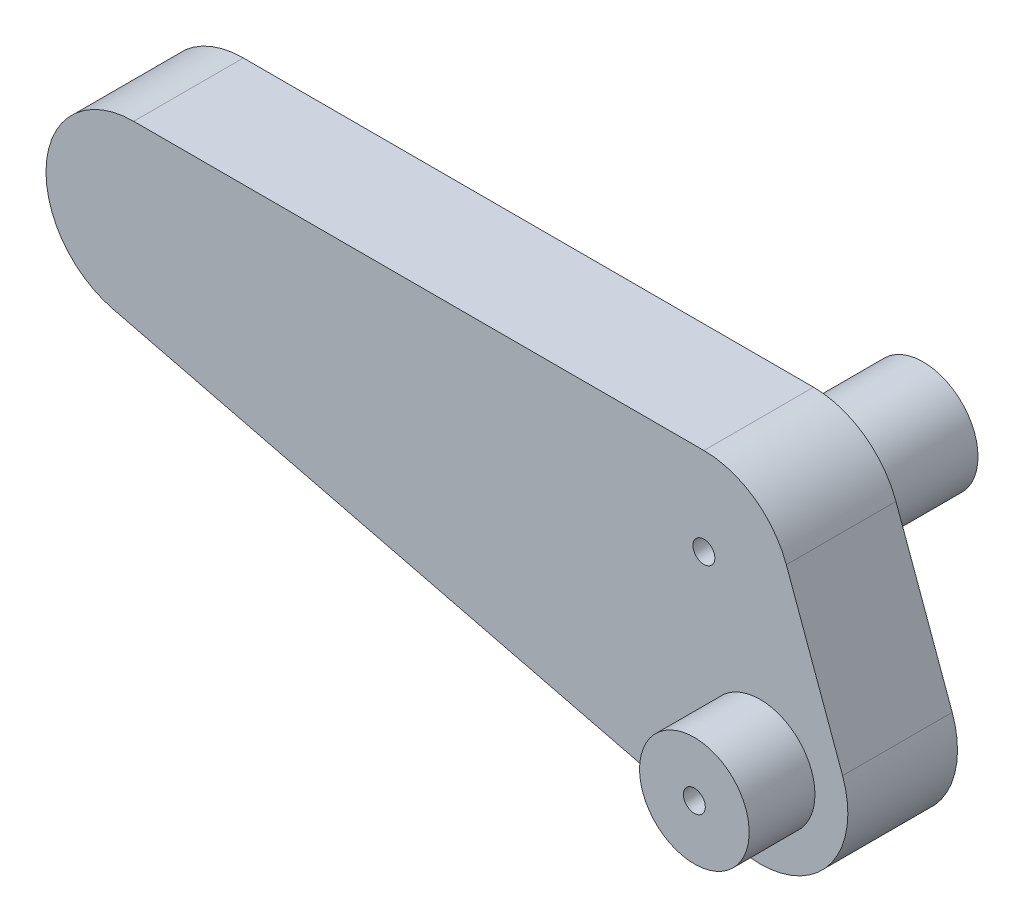
ISO-10303-21;
HEADER;
FILE_DESCRIPTION(('STEP AP214'),'2;1');
FILE_NAME('part.step','',(''),(''),'','','');
FILE_SCHEMA(('AUTOMOTIVE_DESIGN { 1 0 10303 214 1 1 1 1 }'));
ENDSEC;
DATA;
#1=APPLICATION_CONTEXT('core data for automotive mechanical design processes');
#2=APPLICATION_PROTOCOL_DEFINITION('international standard','automotive_design',2000,#1);
#3=PRODUCT_CONTEXT('',#1,'mechanical');
#4=PRODUCT('Part','Part','',(#3));
#5=PRODUCT_RELATED_PRODUCT_CATEGORY('part','',(#4));
#6=PRODUCT_DEFINITION_FORMATION('','',#4);
#7=PRODUCT_DEFINITION_CONTEXT('part definition',#1,'design');
#8=PRODUCT_DEFINITION('design','',#6,#7);
#9=PRODUCT_DEFINITION_SHAPE('','',#8);
#10=(LENGTH_UNIT() NAMED_UNIT(*) SI_UNIT(.MILLI.,.METRE.));
#11=(NAMED_UNIT(*) PLANE_ANGLE_UNIT() SI_UNIT($,.RADIAN.));
#12=(NAMED_UNIT(*) SI_UNIT($,.STERADIAN.) SOLID_ANGLE_UNIT());
#13=UNCERTAINTY_MEASURE_WITH_UNIT(LENGTH_MEASURE(1.E-05),#10,'distance_accuracy_value','');
#14=(GEOMETRIC_REPRESENTATION_CONTEXT(3) GLOBAL_UNCERTAINTY_ASSIGNED_CONTEXT((#13)) GLOBAL_UNIT_ASSIGNED_CONTEXT((#10,
#11,#12)) REPRESENTATION_CONTEXT('',''));
#15=CARTESIAN_POINT('',(0.,0.,0.));
#16=DIRECTION('',(0.,0.,1.));
#17=DIRECTION('',(1.,0.,0.));
#18=AXIS2_PLACEMENT_3D('',#15,#16,#17);
#19=CARTESIAN_POINT('',(0.,0.,5.));
#20=DIRECTION('',(0.,0.,1.));
#21=DIRECTION('',(1.,0.,0.));
#22=AXIS2_PLACEMENT_3D('',#19,#20,#21);
#23=PLANE('',#22);
#24=CARTESIAN_POINT('',(0.,0.,5.));
#25=DIRECTION('',(0.,0.,1.));
#26=DIRECTION('',(1.,0.,0.));
#27=AXIS2_PLACEMENT_3D('',#24,#25,#26);
#28=CIRCLE('',#27,4.);
#29=CARTESIAN_POINT('',(3.75877048314363,1.36808057330269,5.));
#30=VERTEX_POINT('',#29);
#31=CARTESIAN_POINT('',(0.,4.,5.));
#32=VERTEX_POINT('',#31);
#33=EDGE_CURVE('E130',#30,#32,#28,.T.);
#34=ORIENTED_EDGE('',*,*,#33,.T.);
#35=DIRECTION('',(-1.,0.,0.));
#36=VECTOR('',#35,1.);
#37=CARTESIAN_POINT('',(-26.,4.,5.));
#38=LINE('',#37,#36);
#39=CARTESIAN_POINT('',(-26.,4.,5.));
#40=VERTEX_POINT('',#39);
#41=EDGE_CURVE('E88',#32,#40,#38,.T.);
#42=ORIENTED_EDGE('',*,*,#41,.T.);
#43=CARTESIAN_POINT('',(-26.,0.,5.));
#44=DIRECTION('',(0.,0.,1.));
#45=DIRECTION('',(1.,0.,0.));
#46=AXIS2_PLACEMENT_3D('',#43,#44,#45);
#47=CIRCLE('',#46,4.);
#48=CARTESIAN_POINT('',(-26.958162017145,-3.8835454869102,5.));
#49=VERTEX_POINT('',#48);
#50=EDGE_CURVE('E101',#40,#49,#47,.T.);
#51=ORIENTED_EDGE('',*,*,#50,.T.);
#52=DIRECTION('',(0.97088637172755,-0.239540504286257,0.));
#53=VECTOR('',#52,1.);
#54=CARTESIAN_POINT('',(1.60698905779752,-10.9312401428045,5.));
#55=LINE('',#54,#53);
#56=CARTESIAN_POINT('',(1.60698905779752,-10.9312401428045,5.));
#57=VERTEX_POINT('',#56);
#58=EDGE_CURVE('E95',#49,#57,#55,.T.);
#59=ORIENTED_EDGE('',*,*,#58,.T.);
#60=CARTESIAN_POINT('',(2.56515107494255,-7.0476946558943,5.));
#61=DIRECTION('',(0.,0.,1.));
#62=DIRECTION('',(1.,0.,0.));
#63=AXIS2_PLACEMENT_3D('',#60,#61,#62);
#64=CIRCLE('',#63,4.);
#65=CARTESIAN_POINT('',(6.32392155808617,-5.67961408259161,5.));
#66=VERTEX_POINT('',#65);
#67=EDGE_CURVE('E99',#57,#66,#64,.T.);
#68=ORIENTED_EDGE('',*,*,#67,.T.);
#69=DIRECTION('',(-0.342020143325673,0.939692620785907,0.));
#70=VECTOR('',#69,1.);
#71=CARTESIAN_POINT('',(3.75877048314363,1.36808057330269,5.));
#72=LINE('',#71,#70);
#73=EDGE_CURVE('E51',#66,#30,#72,.T.);
#74=ORIENTED_EDGE('',*,*,#73,.T.);
#75=EDGE_LOOP('',(#34,#42,#51,#59,#68,#74));
#76=FACE_BOUND('',#75,.T.);
#77=CARTESIAN_POINT('',(2.56515107494255,-7.0476946558943,5.));
#78=DIRECTION('',(0.,0.,1.));
#79=DIRECTION('',(1.,0.,0.));
#80=AXIS2_PLACEMENT_3D('',#77,#78,#79);
#81=CIRCLE('',#80,2.5);
#82=CARTESIAN_POINT('',(5.06515107494255,-7.0476946558943,5.));
#83=VERTEX_POINT('',#82);
#84=EDGE_CURVE('E123',#83,#83,#81,.T.);
#85=ORIENTED_EDGE('',*,*,#84,.F.);
#86=EDGE_LOOP('',(#85));
#87=FACE_BOUND('',#86,.T.);
#88=CARTESIAN_POINT('',(0.,0.,5.));
#89=DIRECTION('',(0.,0.,1.));
#90=DIRECTION('',(1.,0.,0.));
#91=AXIS2_PLACEMENT_3D('',#88,#89,#90);
#92=CIRCLE('',#91,0.5);
#93=CARTESIAN_POINT('',(0.5,0.,5.));
#94=VERTEX_POINT('',#93);
#95=EDGE_CURVE('E197',#94,#94,#92,.T.);
#96=ORIENTED_EDGE('',*,*,#95,.F.);
#97=EDGE_LOOP('',(#96));
#98=FACE_BOUND('',#97,.T.);
#99=ADVANCED_FACE('F34',(#76,#87,#98),#23,.T.);
#100=CARTESIAN_POINT('',(0.,0.,0.));
#101=DIRECTION('',(0.,0.,1.));
#102=DIRECTION('',(1.,0.,0.));
#103=AXIS2_PLACEMENT_3D('',#100,#101,#102);
#104=PLANE('',#103);
#105=CARTESIAN_POINT('',(0.,0.,0.));
#106=DIRECTION('',(0.,0.,1.));
#107=DIRECTION('',(1.,0.,0.));
#108=AXIS2_PLACEMENT_3D('',#105,#106,#107);
#109=CIRCLE('',#108,4.);
#110=CARTESIAN_POINT('',(3.75877048314363,1.36808057330269,0.));
#111=VERTEX_POINT('',#110);
#112=CARTESIAN_POINT('',(0.,4.,0.));
#113=VERTEX_POINT('',#112);
#114=EDGE_CURVE('E119',#111,#113,#109,.T.);
#115=ORIENTED_EDGE('',*,*,#114,.F.);
#116=DIRECTION('',(-0.342020143325673,0.939692620785907,0.));
#117=VECTOR('',#116,1.);
#118=CARTESIAN_POINT('',(3.75877048314363,1.36808057330269,0.));
#119=LINE('',#118,#117);
#120=CARTESIAN_POINT('',(6.32392155808617,-5.67961408259161,0.));
#121=VERTEX_POINT('',#120);
#122=EDGE_CURVE('E80',#121,#111,#119,.T.);
#123=ORIENTED_EDGE('',*,*,#122,.F.);
#124=CARTESIAN_POINT('',(2.56515107494255,-7.0476946558943,0.));
#125=DIRECTION('',(0.,0.,1.));
#126=DIRECTION('',(1.,0.,0.));
#127=AXIS2_PLACEMENT_3D('',#124,#125,#126);
#128=CIRCLE('',#127,4.);
#129=CARTESIAN_POINT('',(1.60698905779752,-10.9312401428045,0.));
#130=VERTEX_POINT('',#129);
#131=EDGE_CURVE('E74',#130,#121,#128,.T.);
#132=ORIENTED_EDGE('',*,*,#131,.F.);
#133=DIRECTION('',(0.97088637172755,-0.239540504286257,0.));
#134=VECTOR('',#133,1.);
#135=CARTESIAN_POINT('',(1.60698905779752,-10.9312401428045,0.));
#136=LINE('',#135,#134);
#137=CARTESIAN_POINT('',(-26.958162017145,-3.8835454869102,0.));
#138=VERTEX_POINT('',#137);
#139=EDGE_CURVE('E109',#138,#130,#136,.T.);
#140=ORIENTED_EDGE('',*,*,#139,.F.);
#141=CARTESIAN_POINT('',(-26.,0.,0.));
#142=DIRECTION('',(0.,0.,1.));
#143=DIRECTION('',(1.,0.,0.));
#144=AXIS2_PLACEMENT_3D('',#141,#142,#143);
#145=CIRCLE('',#144,4.);
#146=CARTESIAN_POINT('',(-26.,4.,0.));
#147=VERTEX_POINT('',#146);
#148=EDGE_CURVE('E125',#147,#138,#145,.T.);
#149=ORIENTED_EDGE('',*,*,#148,.F.);
#150=DIRECTION('',(-1.,0.,0.));
#151=VECTOR('',#150,1.);
#152=CARTESIAN_POINT('',(-26.,4.,0.));
#153=LINE('',#152,#151);
#154=EDGE_CURVE('E122',#113,#147,#153,.T.);
#155=ORIENTED_EDGE('',*,*,#154,.F.);
#156=EDGE_LOOP('',(#115,#123,#132,#140,#149,#155));
#157=FACE_BOUND('',#156,.T.);
#158=CARTESIAN_POINT('',(0.,0.,0.));
#159=DIRECTION('',(0.,0.,1.));
#160=DIRECTION('',(1.,0.,0.));
#161=AXIS2_PLACEMENT_3D('',#158,#159,#160);
#162=CIRCLE('',#161,2.5);
#163=CARTESIAN_POINT('',(2.5,0.,0.));
#164=VERTEX_POINT('',#163);
#165=EDGE_CURVE('E206',#164,#164,#162,.T.);
#166=ORIENTED_EDGE('',*,*,#165,.T.);
#167=EDGE_LOOP('',(#166));
#168=FACE_BOUND('',#167,.T.);
#169=CARTESIAN_POINT('',(2.56515107494255,-7.0476946558943,0.));
#170=DIRECTION('',(0.,0.,-1.));
#171=DIRECTION('',(-1.,0.,0.));
#172=AXIS2_PLACEMENT_3D('',#169,#170,#171);
#173=CIRCLE('',#172,0.5);
#174=CARTESIAN_POINT('',(2.06515107494255,-7.0476946558943,0.));
#175=VERTEX_POINT('',#174);
#176=EDGE_CURVE('E189',#175,#175,#173,.T.);
#177=ORIENTED_EDGE('',*,*,#176,.F.);
#178=EDGE_LOOP('',(#177));
#179=FACE_BOUND('',#178,.T.);
#180=ADVANCED_FACE('F139',(#157,#168,#179),#104,.F.);
#181=CARTESIAN_POINT('',(0.,0.,5.));
#182=DIRECTION('',(0.,0.,-1.));
#183=DIRECTION('',(-1.,0.,0.));
#184=AXIS2_PLACEMENT_3D('',#181,#182,#183);
#185=CYLINDRICAL_SURFACE('',#184,4.);
#186=ORIENTED_EDGE('',*,*,#114,.T.);
#187=DIRECTION('',(0.,0.,-1.));
#188=VECTOR('',#187,1.);
#189=CARTESIAN_POINT('',(0.,4.,5.));
#190=LINE('',#189,#188);
#191=EDGE_CURVE('E11',#32,#113,#190,.T.);
#192=ORIENTED_EDGE('',*,*,#191,.F.);
#193=ORIENTED_EDGE('',*,*,#33,.F.);
#194=DIRECTION('',(0.,0.,-1.));
#195=VECTOR('',#194,1.);
#196=CARTESIAN_POINT('',(3.75877048314363,1.36808057330269,5.));
#197=LINE('',#196,#195);
#198=EDGE_CURVE('E115',#30,#111,#197,.T.);
#199=ORIENTED_EDGE('',*,*,#198,.T.);
#200=EDGE_LOOP('',(#186,#192,#193,#199));
#201=FACE_BOUND('',#200,.T.);
#202=ADVANCED_FACE('F36',(#201),#185,.T.);
#203=CARTESIAN_POINT('',(-26.,4.,5.));
#204=DIRECTION('',(0.,-1.,0.));
#205=DIRECTION('',(1.,0.,0.));
#206=AXIS2_PLACEMENT_3D('',#203,#204,#205);
#207=PLANE('',#206);
#208=ORIENTED_EDGE('',*,*,#154,.T.);
#209=DIRECTION('',(0.,0.,-1.));
#210=VECTOR('',#209,1.);
#211=CARTESIAN_POINT('',(-26.,4.,5.));
#212=LINE('',#211,#210);
#213=EDGE_CURVE('E43',#40,#147,#212,.T.);
#214=ORIENTED_EDGE('',*,*,#213,.F.);
#215=ORIENTED_EDGE('',*,*,#41,.F.);
#216=ORIENTED_EDGE('',*,*,#191,.T.);
#217=EDGE_LOOP('',(#208,#214,#215,#216));
#218=FACE_BOUND('',#217,.T.);
#219=ADVANCED_FACE('F272',(#218),#207,.F.);
#220=CARTESIAN_POINT('',(-26.,0.,5.));
#221=DIRECTION('',(0.,0.,-1.));
#222=DIRECTION('',(-1.,0.,0.));
#223=AXIS2_PLACEMENT_3D('',#220,#221,#222);
#224=CYLINDRICAL_SURFACE('',#223,4.);
#225=ORIENTED_EDGE('',*,*,#148,.T.);
#226=DIRECTION('',(0.,0.,-1.));
#227=VECTOR('',#226,1.);
#228=CARTESIAN_POINT('',(-26.958162017145,-3.8835454869102,5.));
#229=LINE('',#228,#227);
#230=EDGE_CURVE('E110',#49,#138,#229,.T.);
#231=ORIENTED_EDGE('',*,*,#230,.F.);
#232=ORIENTED_EDGE('',*,*,#50,.F.);
#233=ORIENTED_EDGE('',*,*,#213,.T.);
#234=EDGE_LOOP('',(#225,#231,#232,#233));
#235=FACE_BOUND('',#234,.T.);
#236=ADVANCED_FACE('F136',(#235),#224,.T.);
#237=CARTESIAN_POINT('',(1.60698905779752,-10.9312401428045,5.));
#238=DIRECTION('',(0.239540504286257,0.97088637172755,0.));
#239=DIRECTION('',(-0.97088637172755,0.239540504286257,0.));
#240=AXIS2_PLACEMENT_3D('',#237,#238,#239);
#241=PLANE('',#240);
#242=ORIENTED_EDGE('',*,*,#139,.T.);
#243=DIRECTION('',(0.,0.,-1.));
#244=VECTOR('',#243,1.);
#245=CARTESIAN_POINT('',(1.60698905779752,-10.9312401428045,5.));
#246=LINE('',#245,#244);
#247=EDGE_CURVE('E106',#57,#130,#246,.T.);
#248=ORIENTED_EDGE('',*,*,#247,.F.);
#249=ORIENTED_EDGE('',*,*,#58,.F.);
#250=ORIENTED_EDGE('',*,*,#230,.T.);
#251=EDGE_LOOP('',(#242,#248,#249,#250));
#252=FACE_BOUND('',#251,.T.);
#253=ADVANCED_FACE('F107',(#252),#241,.F.);
#254=CARTESIAN_POINT('',(2.56515107494255,-7.0476946558943,5.));
#255=DIRECTION('',(0.,0.,-1.));
#256=DIRECTION('',(-1.,0.,0.));
#257=AXIS2_PLACEMENT_3D('',#254,#255,#256);
#258=CYLINDRICAL_SURFACE('',#257,4.);
#259=ORIENTED_EDGE('',*,*,#131,.T.);
#260=DIRECTION('',(0.,0.,-1.));
#261=VECTOR('',#260,1.);
#262=CARTESIAN_POINT('',(6.32392155808617,-5.67961408259161,5.));
#263=LINE('',#262,#261);
#264=EDGE_CURVE('E111',#66,#121,#263,.T.);
#265=ORIENTED_EDGE('',*,*,#264,.F.);
#266=ORIENTED_EDGE('',*,*,#67,.F.);
#267=ORIENTED_EDGE('',*,*,#247,.T.);
#268=EDGE_LOOP('',(#259,#265,#266,#267));
#269=FACE_BOUND('',#268,.T.);
#270=ADVANCED_FACE('F113',(#269),#258,.T.);
#271=CARTESIAN_POINT('',(3.75877048314363,1.36808057330269,5.));
#272=DIRECTION('',(-0.939692620785907,-0.342020143325673,0.));
#273=DIRECTION('',(0.342020143325673,-0.939692620785907,0.));
#274=AXIS2_PLACEMENT_3D('',#271,#272,#273);
#275=PLANE('',#274);
#276=ORIENTED_EDGE('',*,*,#122,.T.);
#277=ORIENTED_EDGE('',*,*,#198,.F.);
#278=ORIENTED_EDGE('',*,*,#73,.F.);
#279=ORIENTED_EDGE('',*,*,#264,.T.);
#280=EDGE_LOOP('',(#276,#277,#278,#279));
#281=FACE_BOUND('',#280,.T.);
#282=ADVANCED_FACE('F144',(#281),#275,.F.);
#283=CARTESIAN_POINT('',(0.,0.,-5.));
#284=DIRECTION('',(0.,0.,1.));
#285=DIRECTION('',(1.,0.,0.));
#286=AXIS2_PLACEMENT_3D('',#283,#284,#285);
#287=CYLINDRICAL_SURFACE('',#286,2.5);
#288=CARTESIAN_POINT('',(0.,0.,-5.));
#289=DIRECTION('',(0.,0.,1.));
#290=DIRECTION('',(1.,0.,0.));
#291=AXIS2_PLACEMENT_3D('',#288,#289,#290);
#292=CIRCLE('',#291,2.5);
#293=CARTESIAN_POINT('',(2.5,0.,-5.));
#294=VERTEX_POINT('',#293);
#295=EDGE_CURVE('E201',#294,#294,#292,.T.);
#296=ORIENTED_EDGE('',*,*,#295,.T.);
#297=EDGE_LOOP('',(#296));
#298=FACE_BOUND('',#297,.T.);
#299=ORIENTED_EDGE('',*,*,#165,.F.);
#300=EDGE_LOOP('',(#299));
#301=FACE_BOUND('',#300,.T.);
#302=ADVANCED_FACE('F146',(#298,#301),#287,.T.);
#303=CARTESIAN_POINT('',(0.,0.,-5.));
#304=DIRECTION('',(0.,0.,1.));
#305=DIRECTION('',(1.,0.,0.));
#306=AXIS2_PLACEMENT_3D('',#303,#304,#305);
#307=PLANE('',#306);
#308=CARTESIAN_POINT('',(0.,0.,-5.));
#309=DIRECTION('',(0.,0.,1.));
#310=DIRECTION('',(1.,0.,0.));
#311=AXIS2_PLACEMENT_3D('',#308,#309,#310);
#312=CIRCLE('',#311,0.5);
#313=CARTESIAN_POINT('',(0.5,0.,-5.));
#314=VERTEX_POINT('',#313);
#315=EDGE_CURVE('E198',#314,#314,#312,.T.);
#316=ORIENTED_EDGE('',*,*,#315,.T.);
#317=EDGE_LOOP('',(#316));
#318=FACE_BOUND('',#317,.T.);
#319=ORIENTED_EDGE('',*,*,#295,.F.);
#320=EDGE_LOOP('',(#319));
#321=FACE_BOUND('',#320,.T.);
#322=ADVANCED_FACE('F152',(#318,#321),#307,.F.);
#323=CARTESIAN_POINT('',(0.,0.,-5.));
#324=DIRECTION('',(0.,0.,1.));
#325=DIRECTION('',(1.,0.,0.));
#326=AXIS2_PLACEMENT_3D('',#323,#324,#325);
#327=CYLINDRICAL_SURFACE('',#326,0.5);
#328=ORIENTED_EDGE('',*,*,#315,.F.);
#329=EDGE_LOOP('',(#328));
#330=FACE_BOUND('',#329,.T.);
#331=ORIENTED_EDGE('',*,*,#95,.T.);
#332=EDGE_LOOP('',(#331));
#333=FACE_BOUND('',#332,.T.);
#334=ADVANCED_FACE('F165',(#330,#333),#327,.F.);
#335=CARTESIAN_POINT('',(2.56515107494255,-7.0476946558943,8.));
#336=DIRECTION('',(0.,0.,-1.));
#337=DIRECTION('',(-1.,0.,0.));
#338=AXIS2_PLACEMENT_3D('',#335,#336,#337);
#339=CYLINDRICAL_SURFACE('',#338,2.5);
#340=ORIENTED_EDGE('',*,*,#84,.T.);
#341=EDGE_LOOP('',(#340));
#342=FACE_BOUND('',#341,.T.);
#343=CARTESIAN_POINT('',(2.56515107494255,-7.0476946558943,8.));
#344=DIRECTION('',(0.,0.,-1.));
#345=DIRECTION('',(-1.,0.,0.));
#346=AXIS2_PLACEMENT_3D('',#343,#344,#345);
#347=CIRCLE('',#346,2.5);
#348=CARTESIAN_POINT('',(0.0651510749425455,-7.0476946558943,8.));
#349=VERTEX_POINT('',#348);
#350=EDGE_CURVE('E192',#349,#349,#347,.T.);
#351=ORIENTED_EDGE('',*,*,#350,.T.);
#352=EDGE_LOOP('',(#351));
#353=FACE_BOUND('',#352,.T.);
#354=ADVANCED_FACE('F169',(#342,#353),#339,.T.);
#355=CARTESIAN_POINT('',(2.56515107494255,-7.0476946558943,8.));
#356=DIRECTION('',(0.,0.,-1.));
#357=DIRECTION('',(-1.,0.,0.));
#358=AXIS2_PLACEMENT_3D('',#355,#356,#357);
#359=PLANE('',#358);
#360=CARTESIAN_POINT('',(2.56515107494255,-7.0476946558943,8.));
#361=DIRECTION('',(0.,0.,-1.));
#362=DIRECTION('',(-1.,0.,0.));
#363=AXIS2_PLACEMENT_3D('',#360,#361,#362);
#364=CIRCLE('',#363,0.5);
#365=CARTESIAN_POINT('',(2.06515107494255,-7.0476946558943,8.));
#366=VERTEX_POINT('',#365);
#367=EDGE_CURVE('E186',#366,#366,#364,.T.);
#368=ORIENTED_EDGE('',*,*,#367,.T.);
#369=EDGE_LOOP('',(#368));
#370=FACE_BOUND('',#369,.T.);
#371=ORIENTED_EDGE('',*,*,#350,.F.);
#372=EDGE_LOOP('',(#371));
#373=FACE_BOUND('',#372,.T.);
#374=ADVANCED_FACE('F173',(#370,#373),#359,.F.);
#375=CARTESIAN_POINT('',(2.56515107494255,-7.0476946558943,8.));
#376=DIRECTION('',(0.,0.,-1.));
#377=DIRECTION('',(-1.,0.,0.));
#378=AXIS2_PLACEMENT_3D('',#375,#376,#377);
#379=CYLINDRICAL_SURFACE('',#378,0.5);
#380=ORIENTED_EDGE('',*,*,#367,.F.);
#381=EDGE_LOOP('',(#380));
#382=FACE_BOUND('',#381,.T.);
#383=ORIENTED_EDGE('',*,*,#176,.T.);
#384=EDGE_LOOP('',(#383));
#385=FACE_BOUND('',#384,.T.);
#386=ADVANCED_FACE('F177',(#382,#385),#379,.F.);
#387=CLOSED_SHELL('',(#99,#180,#202,#219,#236,#253,#270,#282,#302,#322,#334,#354,#374,#386));
#388=MANIFOLD_SOLID_BREP('B2',#387);
#389=ADVANCED_BREP_SHAPE_REPRESENTATION('',(#18,#388),#14);
#390=SHAPE_DEFINITION_REPRESENTATION(#9,#389);
ENDSEC;
END-ISO-10303-21;
